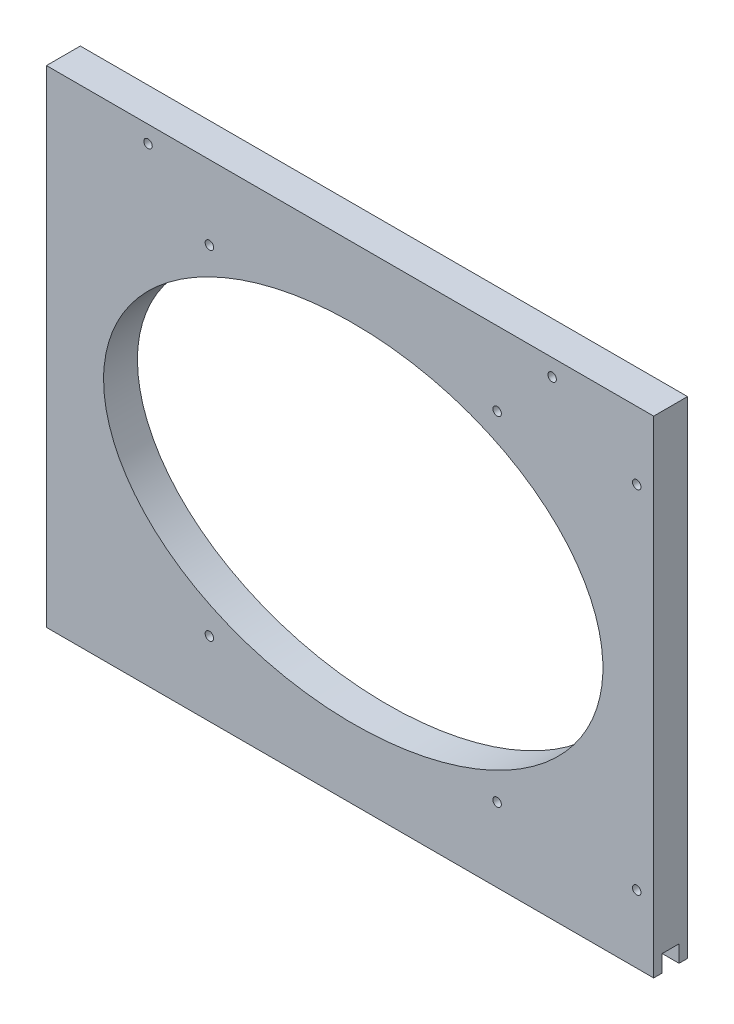
ISO-10303-21;
HEADER;
FILE_DESCRIPTION(('STEP AP214'),'2;1');
FILE_NAME('part.step','',(''),(''),'','','');
FILE_SCHEMA(('AUTOMOTIVE_DESIGN { 1 0 10303 214 1 1 1 1 }'));
ENDSEC;
DATA;
#1=APPLICATION_CONTEXT('core data for automotive mechanical design processes');
#2=APPLICATION_PROTOCOL_DEFINITION('international standard','automotive_design',2000,#1);
#3=PRODUCT_CONTEXT('',#1,'mechanical');
#4=PRODUCT('Part','Part','',(#3));
#5=PRODUCT_RELATED_PRODUCT_CATEGORY('part','',(#4));
#6=PRODUCT_DEFINITION_FORMATION('','',#4);
#7=PRODUCT_DEFINITION_CONTEXT('part definition',#1,'design');
#8=PRODUCT_DEFINITION('design','',#6,#7);
#9=PRODUCT_DEFINITION_SHAPE('','',#8);
#10=(LENGTH_UNIT() NAMED_UNIT(*) SI_UNIT(.MILLI.,.METRE.));
#11=(NAMED_UNIT(*) PLANE_ANGLE_UNIT() SI_UNIT($,.RADIAN.));
#12=(NAMED_UNIT(*) SI_UNIT($,.STERADIAN.) SOLID_ANGLE_UNIT());
#13=UNCERTAINTY_MEASURE_WITH_UNIT(LENGTH_MEASURE(1.E-05),#10,'distance_accuracy_value','');
#14=(GEOMETRIC_REPRESENTATION_CONTEXT(3) GLOBAL_UNCERTAINTY_ASSIGNED_CONTEXT((#13)) GLOBAL_UNIT_ASSIGNED_CONTEXT((#10,
#11,#12)) REPRESENTATION_CONTEXT('',''));
#15=CARTESIAN_POINT('',(0.,0.,0.));
#16=DIRECTION('',(0.,0.,1.));
#17=DIRECTION('',(1.,0.,0.));
#18=AXIS2_PLACEMENT_3D('',#15,#16,#17);
#19=CARTESIAN_POINT('',(-5258.59375,998.5375,-12.7));
#20=DIRECTION('',(0.,-1.,0.));
#21=DIRECTION('',(0.,0.,-1.));
#22=AXIS2_PLACEMENT_3D('',#19,#20,#21);
#23=PLANE('',#22);
#24=DIRECTION('',(1.,0.,0.));
#25=VECTOR('',#24,1.);
#26=CARTESIAN_POINT('',(-5495.38025612107,998.5375,-9.525));
#27=LINE('',#26,#25);
#28=CARTESIAN_POINT('',(-5486.4,998.5375,-9.525));
#29=VERTEX_POINT('',#28);
#30=CARTESIAN_POINT('',(-5258.59375,998.5375,-9.525));
#31=VERTEX_POINT('',#30);
#32=EDGE_CURVE('E134',#29,#31,#27,.T.);
#33=ORIENTED_EDGE('',*,*,#32,.F.);
#34=DIRECTION('',(0.,0.,1.));
#35=VECTOR('',#34,1.);
#36=CARTESIAN_POINT('',(-5486.4,998.5375,-12.7));
#37=LINE('',#36,#35);
#38=CARTESIAN_POINT('',(-5486.4,998.5375,-12.7));
#39=VERTEX_POINT('',#38);
#40=EDGE_CURVE('E123',#39,#29,#37,.T.);
#41=ORIENTED_EDGE('',*,*,#40,.F.);
#42=DIRECTION('',(1.,0.,0.));
#43=VECTOR('',#42,1.);
#44=CARTESIAN_POINT('',(-5258.59375,998.5375,-12.7));
#45=LINE('',#44,#43);
#46=CARTESIAN_POINT('',(-5258.59375,998.5375,-12.7));
#47=VERTEX_POINT('',#46);
#48=EDGE_CURVE('E251',#39,#47,#45,.T.);
#49=ORIENTED_EDGE('',*,*,#48,.T.);
#50=DIRECTION('',(0.,0.,1.));
#51=VECTOR('',#50,1.);
#52=CARTESIAN_POINT('',(-5258.59375,998.5375,-12.7));
#53=LINE('',#52,#51);
#54=EDGE_CURVE('E40',#47,#31,#53,.T.);
#55=ORIENTED_EDGE('',*,*,#54,.T.);
#56=EDGE_LOOP('',(#33,#41,#49,#55));
#57=FACE_BOUND('',#56,.T.);
#58=ADVANCED_FACE('F31',(#57),#23,.T.);
#59=CARTESIAN_POINT('',(-5486.4,1181.1,-12.7));
#60=DIRECTION('',(0.,1.,0.));
#61=DIRECTION('',(0.,0.,1.));
#62=AXIS2_PLACEMENT_3D('',#59,#60,#61);
#63=PLANE('',#62);
#64=DIRECTION('',(-1.,0.,0.));
#65=VECTOR('',#64,1.);
#66=CARTESIAN_POINT('',(-5486.4,1181.1,0.));
#67=LINE('',#66,#65);
#68=CARTESIAN_POINT('',(-5258.59375,1181.1,0.));
#69=VERTEX_POINT('',#68);
#70=CARTESIAN_POINT('',(-5486.4,1181.1,0.));
#71=VERTEX_POINT('',#70);
#72=EDGE_CURVE('E191',#69,#71,#67,.T.);
#73=ORIENTED_EDGE('',*,*,#72,.F.);
#74=DIRECTION('',(0.,0.,1.));
#75=VECTOR('',#74,1.);
#76=CARTESIAN_POINT('',(-5258.59375,1181.1,-12.7));
#77=LINE('',#76,#75);
#78=CARTESIAN_POINT('',(-5258.59375,1181.1,-12.7));
#79=VERTEX_POINT('',#78);
#80=EDGE_CURVE('E11',#79,#69,#77,.T.);
#81=ORIENTED_EDGE('',*,*,#80,.F.);
#82=DIRECTION('',(-1.,0.,0.));
#83=VECTOR('',#82,1.);
#84=CARTESIAN_POINT('',(-5486.4,1181.1,-12.7));
#85=LINE('',#84,#83);
#86=CARTESIAN_POINT('',(-5486.4,1181.1,-12.7));
#87=VERTEX_POINT('',#86);
#88=EDGE_CURVE('E194',#79,#87,#85,.T.);
#89=ORIENTED_EDGE('',*,*,#88,.T.);
#90=DIRECTION('',(0.,0.,1.));
#91=VECTOR('',#90,1.);
#92=CARTESIAN_POINT('',(-5486.4,1181.1,-12.7));
#93=LINE('',#92,#91);
#94=EDGE_CURVE('E35',#87,#71,#93,.T.);
#95=ORIENTED_EDGE('',*,*,#94,.T.);
#96=EDGE_LOOP('',(#73,#81,#89,#95));
#97=FACE_BOUND('',#96,.T.);
#98=ADVANCED_FACE('F33',(#97),#63,.T.);
#99=CARTESIAN_POINT('',(-5258.59375,1181.1,-12.7));
#100=DIRECTION('',(1.,0.,0.));
#101=DIRECTION('',(0.,0.,-1.));
#102=AXIS2_PLACEMENT_3D('',#99,#100,#101);
#103=PLANE('',#102);
#104=DIRECTION('',(0.,1.,0.));
#105=VECTOR('',#104,1.);
#106=CARTESIAN_POINT('',(-5258.59375,1004.8875,-9.525));
#107=LINE('',#106,#105);
#108=CARTESIAN_POINT('',(-5258.59375,1004.8875,-9.525));
#109=VERTEX_POINT('',#108);
#110=EDGE_CURVE('E118',#31,#109,#107,.T.);
#111=ORIENTED_EDGE('',*,*,#110,.F.);
#112=ORIENTED_EDGE('',*,*,#54,.F.);
#113=DIRECTION('',(0.,1.,0.));
#114=VECTOR('',#113,1.);
#115=CARTESIAN_POINT('',(-5258.59375,1181.1,-12.7));
#116=LINE('',#115,#114);
#117=EDGE_CURVE('E239',#47,#79,#116,.T.);
#118=ORIENTED_EDGE('',*,*,#117,.T.);
#119=ORIENTED_EDGE('',*,*,#80,.T.);
#120=DIRECTION('',(0.,1.,0.));
#121=VECTOR('',#120,1.);
#122=CARTESIAN_POINT('',(-5258.59375,1181.1,0.));
#123=LINE('',#122,#121);
#124=CARTESIAN_POINT('',(-5258.59375,998.5375,0.));
#125=VERTEX_POINT('',#124);
#126=EDGE_CURVE('E242',#125,#69,#123,.T.);
#127=ORIENTED_EDGE('',*,*,#126,.F.);
#128=CARTESIAN_POINT('',(-5258.59375,998.5375,-3.175));
#129=VERTEX_POINT('',#128);
#130=EDGE_CURVE('E231',#129,#125,#53,.T.);
#131=ORIENTED_EDGE('',*,*,#130,.F.);
#132=DIRECTION('',(0.,-1.,0.));
#133=VECTOR('',#132,1.);
#134=CARTESIAN_POINT('',(-5258.59375,998.5375,-3.175));
#135=LINE('',#134,#133);
#136=CARTESIAN_POINT('',(-5258.59375,1004.8875,-3.175));
#137=VERTEX_POINT('',#136);
#138=EDGE_CURVE('E124',#137,#129,#135,.T.);
#139=ORIENTED_EDGE('',*,*,#138,.F.);
#140=DIRECTION('',(0.,0.,1.));
#141=VECTOR('',#140,1.);
#142=CARTESIAN_POINT('',(-5258.59375,1004.8875,-3.175));
#143=LINE('',#142,#141);
#144=EDGE_CURVE('E126',#109,#137,#143,.T.);
#145=ORIENTED_EDGE('',*,*,#144,.F.);
#146=EDGE_LOOP('',(#111,#112,#118,#119,#127,#131,#139,#145));
#147=FACE_BOUND('',#146,.T.);
#148=ADVANCED_FACE('F212',(#147),#103,.T.);
#149=DIRECTION('',(1.,0.,0.));
#150=VECTOR('',#149,1.);
#151=CARTESIAN_POINT('',(-5495.38025612107,998.5375,-3.175));
#152=LINE('',#151,#150);
#153=CARTESIAN_POINT('',(-5486.4,998.5375,-3.175));
#154=VERTEX_POINT('',#153);
#155=EDGE_CURVE('E48',#154,#129,#152,.T.);
#156=ORIENTED_EDGE('',*,*,#155,.T.);
#157=ORIENTED_EDGE('',*,*,#130,.T.);
#158=DIRECTION('',(1.,0.,0.));
#159=VECTOR('',#158,1.);
#160=CARTESIAN_POINT('',(-5258.59375,998.5375,0.));
#161=LINE('',#160,#159);
#162=CARTESIAN_POINT('',(-5486.4,998.5375,0.));
#163=VERTEX_POINT('',#162);
#164=EDGE_CURVE('E237',#163,#125,#161,.T.);
#165=ORIENTED_EDGE('',*,*,#164,.F.);
#166=EDGE_CURVE('E236',#154,#163,#37,.T.);
#167=ORIENTED_EDGE('',*,*,#166,.F.);
#168=EDGE_LOOP('',(#156,#157,#165,#167));
#169=FACE_BOUND('',#168,.T.);
#170=ADVANCED_FACE('F215',(#169),#23,.T.);
#171=CARTESIAN_POINT('',(-5486.4,998.5375,-12.7));
#172=DIRECTION('',(-1.,0.,0.));
#173=DIRECTION('',(0.,0.,1.));
#174=AXIS2_PLACEMENT_3D('',#171,#172,#173);
#175=PLANE('',#174);
#176=DIRECTION('',(0.,1.,0.));
#177=VECTOR('',#176,1.);
#178=CARTESIAN_POINT('',(-5486.4,1004.8875,-9.525));
#179=LINE('',#178,#177);
#180=CARTESIAN_POINT('',(-5486.4,1004.8875,-9.525));
#181=VERTEX_POINT('',#180);
#182=EDGE_CURVE('E115',#29,#181,#179,.T.);
#183=ORIENTED_EDGE('',*,*,#182,.T.);
#184=DIRECTION('',(0.,0.,1.));
#185=VECTOR('',#184,1.);
#186=CARTESIAN_POINT('',(-5486.4,1004.8875,-3.175));
#187=LINE('',#186,#185);
#188=CARTESIAN_POINT('',(-5486.4,1004.8875,-3.175));
#189=VERTEX_POINT('',#188);
#190=EDGE_CURVE('E104',#181,#189,#187,.T.);
#191=ORIENTED_EDGE('',*,*,#190,.T.);
#192=DIRECTION('',(0.,-1.,0.));
#193=VECTOR('',#192,1.);
#194=CARTESIAN_POINT('',(-5486.4,998.5375,-3.175));
#195=LINE('',#194,#193);
#196=EDGE_CURVE('E131',#189,#154,#195,.T.);
#197=ORIENTED_EDGE('',*,*,#196,.T.);
#198=ORIENTED_EDGE('',*,*,#166,.T.);
#199=DIRECTION('',(0.,-1.,0.));
#200=VECTOR('',#199,1.);
#201=CARTESIAN_POINT('',(-5486.4,998.5375,0.));
#202=LINE('',#201,#200);
#203=EDGE_CURVE('E246',#71,#163,#202,.T.);
#204=ORIENTED_EDGE('',*,*,#203,.F.);
#205=ORIENTED_EDGE('',*,*,#94,.F.);
#206=DIRECTION('',(0.,-1.,0.));
#207=VECTOR('',#206,1.);
#208=CARTESIAN_POINT('',(-5486.4,998.5375,-12.7));
#209=LINE('',#208,#207);
#210=EDGE_CURVE('E252',#87,#39,#209,.T.);
#211=ORIENTED_EDGE('',*,*,#210,.T.);
#212=ORIENTED_EDGE('',*,*,#40,.T.);
#213=EDGE_LOOP('',(#183,#191,#197,#198,#204,#205,#211,#212));
#214=FACE_BOUND('',#213,.T.);
#215=ADVANCED_FACE('F122',(#214),#175,.T.);
#216=CARTESIAN_POINT('',(-5258.59375,1181.1,-12.7));
#217=DIRECTION('',(0.,0.,-1.));
#218=DIRECTION('',(-1.,0.,0.));
#219=AXIS2_PLACEMENT_3D('',#216,#217,#218);
#220=PLANE('',#219);
#221=CARTESIAN_POINT('',(-5425.28125,1026.31875,-12.7));
#222=DIRECTION('',(0.,0.,-1.));
#223=DIRECTION('',(-1.,0.,0.));
#224=AXIS2_PLACEMENT_3D('',#221,#222,#223);
#225=CIRCLE('',#224,1.58750000000051);
#226=CARTESIAN_POINT('',(-5426.86875,1026.31875,-12.7));
#227=VERTEX_POINT('',#226);
#228=EDGE_CURVE('E140',#227,#227,#225,.F.);
#229=ORIENTED_EDGE('',*,*,#228,.T.);
#230=EDGE_LOOP('',(#229));
#231=FACE_BOUND('',#230,.T.);
#232=CARTESIAN_POINT('',(-5317.33125,1026.31875,-12.7));
#233=DIRECTION('',(0.,0.,-1.));
#234=DIRECTION('',(-1.,0.,0.));
#235=AXIS2_PLACEMENT_3D('',#232,#233,#234);
#236=CIRCLE('',#235,1.58750000000051);
#237=CARTESIAN_POINT('',(-5318.91875,1026.31875,-12.7));
#238=VERTEX_POINT('',#237);
#239=EDGE_CURVE('E146',#238,#238,#236,.F.);
#240=ORIENTED_EDGE('',*,*,#239,.T.);
#241=EDGE_LOOP('',(#240));
#242=FACE_BOUND('',#241,.T.);
#243=CARTESIAN_POINT('',(-5264.94375,1023.9375,-12.7));
#244=DIRECTION('',(0.,0.,-1.));
#245=DIRECTION('',(-1.,0.,0.));
#246=AXIS2_PLACEMENT_3D('',#243,#244,#245);
#247=CIRCLE('',#246,1.58750000000045);
#248=CARTESIAN_POINT('',(-5266.53125,1023.9375,-12.7));
#249=VERTEX_POINT('',#248);
#250=EDGE_CURVE('E152',#249,#249,#247,.F.);
#251=ORIENTED_EDGE('',*,*,#250,.T.);
#252=EDGE_LOOP('',(#251));
#253=FACE_BOUND('',#252,.T.);
#254=CARTESIAN_POINT('',(-5264.94375,1155.7,-12.7));
#255=DIRECTION('',(0.,0.,-1.));
#256=DIRECTION('',(-1.,0.,0.));
#257=AXIS2_PLACEMENT_3D('',#254,#255,#256);
#258=CIRCLE('',#257,1.58750000000051);
#259=CARTESIAN_POINT('',(-5266.53125,1155.7,-12.7));
#260=VERTEX_POINT('',#259);
#261=EDGE_CURVE('E158',#260,#260,#258,.F.);
#262=ORIENTED_EDGE('',*,*,#261,.T.);
#263=EDGE_LOOP('',(#262));
#264=FACE_BOUND('',#263,.T.);
#265=CARTESIAN_POINT('',(-5317.33125,1153.31875,-12.7));
#266=DIRECTION('',(0.,0.,-1.));
#267=DIRECTION('',(-1.,0.,0.));
#268=AXIS2_PLACEMENT_3D('',#265,#266,#267);
#269=CIRCLE('',#268,1.58750000000051);
#270=CARTESIAN_POINT('',(-5318.91875,1153.31875,-12.7));
#271=VERTEX_POINT('',#270);
#272=EDGE_CURVE('E164',#271,#271,#269,.F.);
#273=ORIENTED_EDGE('',*,*,#272,.T.);
#274=EDGE_LOOP('',(#273));
#275=FACE_BOUND('',#274,.T.);
#276=CARTESIAN_POINT('',(-5296.69375,1174.75,-12.7));
#277=DIRECTION('',(0.,0.,-1.));
#278=DIRECTION('',(-1.,0.,0.));
#279=AXIS2_PLACEMENT_3D('',#276,#277,#278);
#280=CIRCLE('',#279,1.58750000000051);
#281=CARTESIAN_POINT('',(-5298.28125,1174.75,-12.7));
#282=VERTEX_POINT('',#281);
#283=EDGE_CURVE('E170',#282,#282,#280,.F.);
#284=ORIENTED_EDGE('',*,*,#283,.T.);
#285=EDGE_LOOP('',(#284));
#286=FACE_BOUND('',#285,.T.);
#287=CARTESIAN_POINT('',(-5425.28125,1153.31875,-12.7));
#288=DIRECTION('',(0.,0.,-1.));
#289=DIRECTION('',(-1.,0.,0.));
#290=AXIS2_PLACEMENT_3D('',#287,#288,#289);
#291=CIRCLE('',#290,1.5874999999996);
#292=CARTESIAN_POINT('',(-5426.86875,1153.31875,-12.7));
#293=VERTEX_POINT('',#292);
#294=EDGE_CURVE('E176',#293,#293,#291,.F.);
#295=ORIENTED_EDGE('',*,*,#294,.T.);
#296=EDGE_LOOP('',(#295));
#297=FACE_BOUND('',#296,.T.);
#298=CARTESIAN_POINT('',(-5448.3,1174.75,-12.7));
#299=DIRECTION('',(0.,0.,-1.));
#300=DIRECTION('',(-1.,0.,0.));
#301=AXIS2_PLACEMENT_3D('',#298,#299,#300);
#302=CIRCLE('',#301,1.5874999999996);
#303=CARTESIAN_POINT('',(-5449.8875,1174.75,-12.7));
#304=VERTEX_POINT('',#303);
#305=EDGE_CURVE('E182',#304,#304,#302,.F.);
#306=ORIENTED_EDGE('',*,*,#305,.T.);
#307=EDGE_LOOP('',(#306));
#308=FACE_BOUND('',#307,.T.);
#309=CARTESIAN_POINT('',(-5371.30625,1089.81875,-12.7));
#310=DIRECTION('',(0.,0.,1.));
#311=DIRECTION('',(-1.,0.,0.));
#312=AXIS2_PLACEMENT_3D('',#309,#310,#311);
#313=ELLIPSE('',#312,93.6624999999998,65.0874999965074);
#314=CARTESIAN_POINT('',(-5464.96875,1089.81875,-12.7));
#315=VERTEX_POINT('',#314);
#316=EDGE_CURVE('E188',#315,#315,#313,.T.);
#317=ORIENTED_EDGE('',*,*,#316,.T.);
#318=EDGE_LOOP('',(#317));
#319=FACE_BOUND('',#318,.T.);
#320=ORIENTED_EDGE('',*,*,#88,.F.);
#321=ORIENTED_EDGE('',*,*,#117,.F.);
#322=ORIENTED_EDGE('',*,*,#48,.F.);
#323=ORIENTED_EDGE('',*,*,#210,.F.);
#324=EDGE_LOOP('',(#320,#321,#322,#323));
#325=FACE_BOUND('',#324,.T.);
#326=ADVANCED_FACE('F205',(#231,#242,#253,#264,#275,#286,#297,#308,#319,#325),#220,.T.);
#327=CARTESIAN_POINT('',(-5258.59375,1181.1,0.));
#328=DIRECTION('',(0.,0.,-1.));
#329=DIRECTION('',(-1.,0.,0.));
#330=AXIS2_PLACEMENT_3D('',#327,#328,#329);
#331=PLANE('',#330);
#332=CARTESIAN_POINT('',(-5425.28125,1026.31875,0.));
#333=DIRECTION('',(0.,0.,1.));
#334=DIRECTION('',(1.,0.,0.));
#335=AXIS2_PLACEMENT_3D('',#332,#333,#334);
#336=CIRCLE('',#335,1.58750000000051);
#337=CARTESIAN_POINT('',(-5423.69375,1026.31875,0.));
#338=VERTEX_POINT('',#337);
#339=EDGE_CURVE('E137',#338,#338,#336,.T.);
#340=ORIENTED_EDGE('',*,*,#339,.F.);
#341=EDGE_LOOP('',(#340));
#342=FACE_BOUND('',#341,.T.);
#343=CARTESIAN_POINT('',(-5317.33125,1026.31875,0.));
#344=DIRECTION('',(0.,0.,1.));
#345=DIRECTION('',(1.,0.,0.));
#346=AXIS2_PLACEMENT_3D('',#343,#344,#345);
#347=CIRCLE('',#346,1.58750000000051);
#348=CARTESIAN_POINT('',(-5315.74375,1026.31875,0.));
#349=VERTEX_POINT('',#348);
#350=EDGE_CURVE('E143',#349,#349,#347,.T.);
#351=ORIENTED_EDGE('',*,*,#350,.F.);
#352=EDGE_LOOP('',(#351));
#353=FACE_BOUND('',#352,.T.);
#354=CARTESIAN_POINT('',(-5264.94375,1023.9375,0.));
#355=DIRECTION('',(0.,0.,1.));
#356=DIRECTION('',(1.,0.,0.));
#357=AXIS2_PLACEMENT_3D('',#354,#355,#356);
#358=CIRCLE('',#357,1.58750000000045);
#359=CARTESIAN_POINT('',(-5263.35625,1023.9375,0.));
#360=VERTEX_POINT('',#359);
#361=EDGE_CURVE('E149',#360,#360,#358,.T.);
#362=ORIENTED_EDGE('',*,*,#361,.F.);
#363=EDGE_LOOP('',(#362));
#364=FACE_BOUND('',#363,.T.);
#365=CARTESIAN_POINT('',(-5264.94375,1155.7,0.));
#366=DIRECTION('',(0.,0.,1.));
#367=DIRECTION('',(1.,0.,0.));
#368=AXIS2_PLACEMENT_3D('',#365,#366,#367);
#369=CIRCLE('',#368,1.58750000000051);
#370=CARTESIAN_POINT('',(-5263.35625,1155.7,0.));
#371=VERTEX_POINT('',#370);
#372=EDGE_CURVE('E155',#371,#371,#369,.T.);
#373=ORIENTED_EDGE('',*,*,#372,.F.);
#374=EDGE_LOOP('',(#373));
#375=FACE_BOUND('',#374,.T.);
#376=CARTESIAN_POINT('',(-5317.33125,1153.31875,0.));
#377=DIRECTION('',(0.,0.,1.));
#378=DIRECTION('',(1.,0.,0.));
#379=AXIS2_PLACEMENT_3D('',#376,#377,#378);
#380=CIRCLE('',#379,1.58750000000051);
#381=CARTESIAN_POINT('',(-5315.74375,1153.31875,0.));
#382=VERTEX_POINT('',#381);
#383=EDGE_CURVE('E161',#382,#382,#380,.T.);
#384=ORIENTED_EDGE('',*,*,#383,.F.);
#385=EDGE_LOOP('',(#384));
#386=FACE_BOUND('',#385,.T.);
#387=CARTESIAN_POINT('',(-5296.69375,1174.75,0.));
#388=DIRECTION('',(0.,0.,1.));
#389=DIRECTION('',(1.,0.,0.));
#390=AXIS2_PLACEMENT_3D('',#387,#388,#389);
#391=CIRCLE('',#390,1.58750000000051);
#392=CARTESIAN_POINT('',(-5295.10625,1174.75,0.));
#393=VERTEX_POINT('',#392);
#394=EDGE_CURVE('E167',#393,#393,#391,.T.);
#395=ORIENTED_EDGE('',*,*,#394,.F.);
#396=EDGE_LOOP('',(#395));
#397=FACE_BOUND('',#396,.T.);
#398=CARTESIAN_POINT('',(-5425.28125,1153.31875,0.));
#399=DIRECTION('',(0.,0.,1.));
#400=DIRECTION('',(1.,0.,0.));
#401=AXIS2_PLACEMENT_3D('',#398,#399,#400);
#402=CIRCLE('',#401,1.5874999999996);
#403=CARTESIAN_POINT('',(-5423.69375,1153.31875,0.));
#404=VERTEX_POINT('',#403);
#405=EDGE_CURVE('E173',#404,#404,#402,.T.);
#406=ORIENTED_EDGE('',*,*,#405,.F.);
#407=EDGE_LOOP('',(#406));
#408=FACE_BOUND('',#407,.T.);
#409=CARTESIAN_POINT('',(-5448.3,1174.75,0.));
#410=DIRECTION('',(0.,0.,1.));
#411=DIRECTION('',(1.,0.,0.));
#412=AXIS2_PLACEMENT_3D('',#409,#410,#411);
#413=CIRCLE('',#412,1.5874999999996);
#414=CARTESIAN_POINT('',(-5446.7125,1174.75,0.));
#415=VERTEX_POINT('',#414);
#416=EDGE_CURVE('E179',#415,#415,#413,.T.);
#417=ORIENTED_EDGE('',*,*,#416,.F.);
#418=EDGE_LOOP('',(#417));
#419=FACE_BOUND('',#418,.T.);
#420=CARTESIAN_POINT('',(-5371.30625,1089.81875,0.));
#421=DIRECTION('',(0.,0.,1.));
#422=DIRECTION('',(-1.,0.,0.));
#423=AXIS2_PLACEMENT_3D('',#420,#421,#422);
#424=ELLIPSE('',#423,93.6624999999998,65.0874999965074);
#425=CARTESIAN_POINT('',(-5464.96875,1089.81875,0.));
#426=VERTEX_POINT('',#425);
#427=EDGE_CURVE('E185',#426,#426,#424,.T.);
#428=ORIENTED_EDGE('',*,*,#427,.F.);
#429=EDGE_LOOP('',(#428));
#430=FACE_BOUND('',#429,.T.);
#431=ORIENTED_EDGE('',*,*,#72,.T.);
#432=ORIENTED_EDGE('',*,*,#203,.T.);
#433=ORIENTED_EDGE('',*,*,#164,.T.);
#434=ORIENTED_EDGE('',*,*,#126,.T.);
#435=EDGE_LOOP('',(#431,#432,#433,#434));
#436=FACE_BOUND('',#435,.T.);
#437=ADVANCED_FACE('F202',(#342,#353,#364,#375,#386,#397,#408,#419,#430,#436),#331,.F.);
#438=CARTESIAN_POINT('',(-5371.30625,1089.81875,-240.814414818926));
#439=DIRECTION('',(0.,0.,1.));
#440=DIRECTION('',(-1.,0.,0.));
#441=AXIS2_PLACEMENT_3D('',#438,#439,#440);
#442=ELLIPSE('',#441,93.6624999999998,65.0874999965074);
#443=DIRECTION('',(0.,0.,1.));
#444=VECTOR('',#443,1.);
#445=SURFACE_OF_LINEAR_EXTRUSION('',#442,#444);
#446=ORIENTED_EDGE('',*,*,#427,.T.);
#447=EDGE_LOOP('',(#446));
#448=FACE_BOUND('',#447,.T.);
#449=ORIENTED_EDGE('',*,*,#316,.F.);
#450=EDGE_LOOP('',(#449));
#451=FACE_BOUND('',#450,.T.);
#452=ADVANCED_FACE('F197',(#448,#451),#445,.F.);
#453=CARTESIAN_POINT('',(-5448.3,1174.75,-240.814414818926));
#454=DIRECTION('',(0.,0.,1.));
#455=DIRECTION('',(1.,0.,0.));
#456=AXIS2_PLACEMENT_3D('',#453,#454,#455);
#457=CYLINDRICAL_SURFACE('',#456,1.5874999999996);
#458=ORIENTED_EDGE('',*,*,#416,.T.);
#459=EDGE_LOOP('',(#458));
#460=FACE_BOUND('',#459,.T.);
#461=ORIENTED_EDGE('',*,*,#305,.F.);
#462=EDGE_LOOP('',(#461));
#463=FACE_BOUND('',#462,.T.);
#464=ADVANCED_FACE('F201',(#460,#463),#457,.F.);
#465=CARTESIAN_POINT('',(-5425.28125,1153.31875,-240.814414818926));
#466=DIRECTION('',(0.,0.,1.));
#467=DIRECTION('',(1.,0.,0.));
#468=AXIS2_PLACEMENT_3D('',#465,#466,#467);
#469=CYLINDRICAL_SURFACE('',#468,1.5874999999996);
#470=ORIENTED_EDGE('',*,*,#405,.T.);
#471=EDGE_LOOP('',(#470));
#472=FACE_BOUND('',#471,.T.);
#473=ORIENTED_EDGE('',*,*,#294,.F.);
#474=EDGE_LOOP('',(#473));
#475=FACE_BOUND('',#474,.T.);
#476=ADVANCED_FACE('F287',(#472,#475),#469,.F.);
#477=CARTESIAN_POINT('',(-5296.69375,1174.75,-240.814414818926));
#478=DIRECTION('',(0.,0.,1.));
#479=DIRECTION('',(1.,0.,0.));
#480=AXIS2_PLACEMENT_3D('',#477,#478,#479);
#481=CYLINDRICAL_SURFACE('',#480,1.58750000000051);
#482=ORIENTED_EDGE('',*,*,#394,.T.);
#483=EDGE_LOOP('',(#482));
#484=FACE_BOUND('',#483,.T.);
#485=ORIENTED_EDGE('',*,*,#283,.F.);
#486=EDGE_LOOP('',(#485));
#487=FACE_BOUND('',#486,.T.);
#488=ADVANCED_FACE('F284',(#484,#487),#481,.F.);
#489=CARTESIAN_POINT('',(-5317.33125,1153.31875,-240.814414818926));
#490=DIRECTION('',(0.,0.,1.));
#491=DIRECTION('',(1.,0.,0.));
#492=AXIS2_PLACEMENT_3D('',#489,#490,#491);
#493=CYLINDRICAL_SURFACE('',#492,1.58750000000051);
#494=ORIENTED_EDGE('',*,*,#383,.T.);
#495=EDGE_LOOP('',(#494));
#496=FACE_BOUND('',#495,.T.);
#497=ORIENTED_EDGE('',*,*,#272,.F.);
#498=EDGE_LOOP('',(#497));
#499=FACE_BOUND('',#498,.T.);
#500=ADVANCED_FACE('F280',(#496,#499),#493,.F.);
#501=CARTESIAN_POINT('',(-5264.94375,1155.7,-240.814414818926));
#502=DIRECTION('',(0.,0.,1.));
#503=DIRECTION('',(1.,0.,0.));
#504=AXIS2_PLACEMENT_3D('',#501,#502,#503);
#505=CYLINDRICAL_SURFACE('',#504,1.58750000000051);
#506=ORIENTED_EDGE('',*,*,#372,.T.);
#507=EDGE_LOOP('',(#506));
#508=FACE_BOUND('',#507,.T.);
#509=ORIENTED_EDGE('',*,*,#261,.F.);
#510=EDGE_LOOP('',(#509));
#511=FACE_BOUND('',#510,.T.);
#512=ADVANCED_FACE('F276',(#508,#511),#505,.F.);
#513=CARTESIAN_POINT('',(-5264.94375,1023.9375,-240.814414818926));
#514=DIRECTION('',(0.,0.,1.));
#515=DIRECTION('',(1.,0.,0.));
#516=AXIS2_PLACEMENT_3D('',#513,#514,#515);
#517=CYLINDRICAL_SURFACE('',#516,1.58750000000045);
#518=ORIENTED_EDGE('',*,*,#361,.T.);
#519=EDGE_LOOP('',(#518));
#520=FACE_BOUND('',#519,.T.);
#521=ORIENTED_EDGE('',*,*,#250,.F.);
#522=EDGE_LOOP('',(#521));
#523=FACE_BOUND('',#522,.T.);
#524=ADVANCED_FACE('F272',(#520,#523),#517,.F.);
#525=CARTESIAN_POINT('',(-5317.33125,1026.31875,-240.814414818926));
#526=DIRECTION('',(0.,0.,1.));
#527=DIRECTION('',(1.,0.,0.));
#528=AXIS2_PLACEMENT_3D('',#525,#526,#527);
#529=CYLINDRICAL_SURFACE('',#528,1.58750000000051);
#530=ORIENTED_EDGE('',*,*,#350,.T.);
#531=EDGE_LOOP('',(#530));
#532=FACE_BOUND('',#531,.T.);
#533=ORIENTED_EDGE('',*,*,#239,.F.);
#534=EDGE_LOOP('',(#533));
#535=FACE_BOUND('',#534,.T.);
#536=ADVANCED_FACE('F268',(#532,#535),#529,.F.);
#537=CARTESIAN_POINT('',(-5425.28125,1026.31875,-240.814414818926));
#538=DIRECTION('',(0.,0.,1.));
#539=DIRECTION('',(1.,0.,0.));
#540=AXIS2_PLACEMENT_3D('',#537,#538,#539);
#541=CYLINDRICAL_SURFACE('',#540,1.58750000000051);
#542=ORIENTED_EDGE('',*,*,#339,.T.);
#543=EDGE_LOOP('',(#542));
#544=FACE_BOUND('',#543,.T.);
#545=ORIENTED_EDGE('',*,*,#228,.F.);
#546=EDGE_LOOP('',(#545));
#547=FACE_BOUND('',#546,.T.);
#548=ADVANCED_FACE('F265',(#544,#547),#541,.F.);
#549=CARTESIAN_POINT('',(-5495.38025612107,1004.8875,-9.525));
#550=DIRECTION('',(0.,0.,-1.));
#551=DIRECTION('',(-1.,0.,0.));
#552=AXIS2_PLACEMENT_3D('',#549,#550,#551);
#553=PLANE('',#552);
#554=ORIENTED_EDGE('',*,*,#32,.T.);
#555=ORIENTED_EDGE('',*,*,#110,.T.);
#556=DIRECTION('',(1.,0.,0.));
#557=VECTOR('',#556,1.);
#558=CARTESIAN_POINT('',(-5495.38025612107,1004.8875,-9.525));
#559=LINE('',#558,#557);
#560=EDGE_CURVE('E108',#181,#109,#559,.T.);
#561=ORIENTED_EDGE('',*,*,#560,.F.);
#562=ORIENTED_EDGE('',*,*,#182,.F.);
#563=EDGE_LOOP('',(#554,#555,#561,#562));
#564=FACE_BOUND('',#563,.T.);
#565=ADVANCED_FACE('F114',(#564),#553,.F.);
#566=CARTESIAN_POINT('',(-5495.38025612107,1004.8875,-3.175));
#567=DIRECTION('',(0.,1.,0.));
#568=DIRECTION('',(0.,0.,1.));
#569=AXIS2_PLACEMENT_3D('',#566,#567,#568);
#570=PLANE('',#569);
#571=ORIENTED_EDGE('',*,*,#560,.T.);
#572=ORIENTED_EDGE('',*,*,#144,.T.);
#573=DIRECTION('',(1.,0.,0.));
#574=VECTOR('',#573,1.);
#575=CARTESIAN_POINT('',(-5495.38025612107,1004.8875,-3.175));
#576=LINE('',#575,#574);
#577=EDGE_CURVE('E110',#189,#137,#576,.T.);
#578=ORIENTED_EDGE('',*,*,#577,.F.);
#579=ORIENTED_EDGE('',*,*,#190,.F.);
#580=EDGE_LOOP('',(#571,#572,#578,#579));
#581=FACE_BOUND('',#580,.T.);
#582=ADVANCED_FACE('F106',(#581),#570,.F.);
#583=CARTESIAN_POINT('',(-5495.38025612107,998.5375,-3.175));
#584=DIRECTION('',(0.,0.,1.));
#585=DIRECTION('',(1.,0.,0.));
#586=AXIS2_PLACEMENT_3D('',#583,#584,#585);
#587=PLANE('',#586);
#588=ORIENTED_EDGE('',*,*,#577,.T.);
#589=ORIENTED_EDGE('',*,*,#138,.T.);
#590=ORIENTED_EDGE('',*,*,#155,.F.);
#591=ORIENTED_EDGE('',*,*,#196,.F.);
#592=EDGE_LOOP('',(#588,#589,#590,#591));
#593=FACE_BOUND('',#592,.T.);
#594=ADVANCED_FACE('F232',(#593),#587,.F.);
#595=CLOSED_SHELL('',(#58,#98,#148,#170,#215,#326,#437,#452,#464,#476,#488,#500,#512,#524,#536,
#548,#565,#582,#594));
#596=MANIFOLD_SOLID_BREP('B2',#595);
#597=ADVANCED_BREP_SHAPE_REPRESENTATION('',(#18,#596),#14);
#598=SHAPE_DEFINITION_REPRESENTATION(#9,#597);
ENDSEC;
END-ISO-10303-21;
